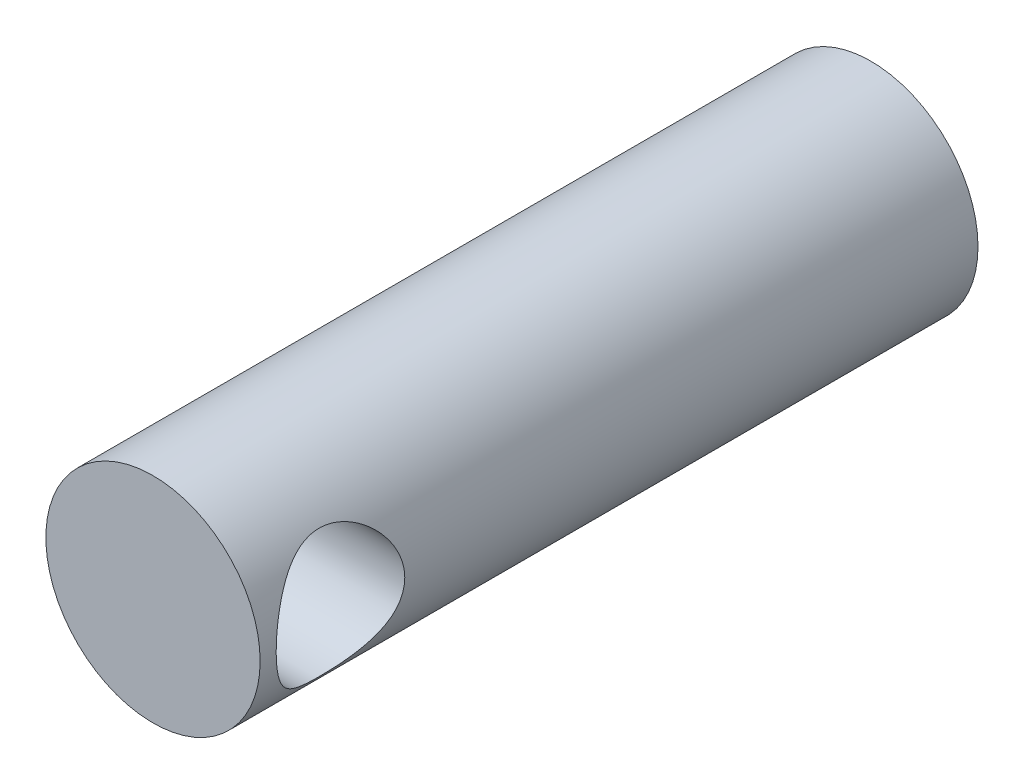
ISO-10303-21;
HEADER;
FILE_DESCRIPTION(('STEP AP214'),'2;1');
FILE_NAME('part.step','',(''),(''),'','','');
FILE_SCHEMA(('AUTOMOTIVE_DESIGN { 1 0 10303 214 1 1 1 1 }'));
ENDSEC;
DATA;
#1=APPLICATION_CONTEXT('core data for automotive mechanical design processes');
#2=APPLICATION_PROTOCOL_DEFINITION('international standard','automotive_design',2000,#1);
#3=PRODUCT_CONTEXT('',#1,'mechanical');
#4=PRODUCT('Part','Part','',(#3));
#5=PRODUCT_RELATED_PRODUCT_CATEGORY('part','',(#4));
#6=PRODUCT_DEFINITION_FORMATION('','',#4);
#7=PRODUCT_DEFINITION_CONTEXT('part definition',#1,'design');
#8=PRODUCT_DEFINITION('design','',#6,#7);
#9=PRODUCT_DEFINITION_SHAPE('','',#8);
#10=(LENGTH_UNIT() NAMED_UNIT(*) SI_UNIT(.MILLI.,.METRE.));
#11=(NAMED_UNIT(*) PLANE_ANGLE_UNIT() SI_UNIT($,.RADIAN.));
#12=(NAMED_UNIT(*) SI_UNIT($,.STERADIAN.) SOLID_ANGLE_UNIT());
#13=UNCERTAINTY_MEASURE_WITH_UNIT(LENGTH_MEASURE(1.E-05),#10,'distance_accuracy_value','');
#14=(GEOMETRIC_REPRESENTATION_CONTEXT(3) GLOBAL_UNCERTAINTY_ASSIGNED_CONTEXT((#13)) GLOBAL_UNIT_ASSIGNED_CONTEXT((#10,
#11,#12)) REPRESENTATION_CONTEXT('',''));
#15=CARTESIAN_POINT('',(0.,0.,0.));
#16=DIRECTION('',(0.,0.,1.));
#17=DIRECTION('',(1.,0.,0.));
#18=AXIS2_PLACEMENT_3D('',#15,#16,#17);
#19=CARTESIAN_POINT('',(0.,0.,67.));
#20=DIRECTION('',(0.,0.,-1.));
#21=DIRECTION('',(-1.,0.,0.));
#22=AXIS2_PLACEMENT_3D('',#19,#20,#21);
#23=CYLINDRICAL_SURFACE('',#22,10.);
#24=CARTESIAN_POINT('',(-10.,0.,53.5));
#25=CARTESIAN_POINT('',(-9.99999883168644,0.153537444551437,53.5000012548086));
#26=CARTESIAN_POINT('',(-9.99645496091162,0.307113729394928,53.5059026426005));
#27=CARTESIAN_POINT('',(-9.98236364463673,0.613107521326879,53.5294330131588));
#28=CARTESIAN_POINT('',(-9.97181210130936,0.765524297600021,53.5470688578121));
#29=CARTESIAN_POINT('',(-9.94394249918953,1.06824745150987,53.5938721043492));
#30=CARTESIAN_POINT('',(-9.92661163049899,1.21854927251923,53.6230613382259));
#31=CARTESIAN_POINT('',(-9.8856010527718,1.51572002727398,53.6925999382584));
#32=CARTESIAN_POINT('',(-9.86191863289495,1.66258746605991,53.7329540698223));
#33=CARTESIAN_POINT('',(-9.80890481966906,1.95109561530948,53.824087600897));
#34=CARTESIAN_POINT('',(-9.77960483164847,2.0927603969022,53.87480914043));
#35=CARTESIAN_POINT('',(-9.7159192851634,2.37093083799643,53.9862743691114));
#36=CARTESIAN_POINT('',(-9.68153176235135,2.50743447905546,54.0470219304578));
#37=CARTESIAN_POINT('',(-9.57184162303337,2.90796291658618,54.2433840785194));
#38=CARTESIAN_POINT('',(-9.48994167822569,3.16336977600851,54.3932348593339));
#39=CARTESIAN_POINT('',(-9.30821070093224,3.66523770071096,54.7391081430813));
#40=CARTESIAN_POINT('',(-9.20748739861886,3.90952112480154,54.9377851324869));
#41=CARTESIAN_POINT('',(-9.00120183744764,4.36354579042123,55.369898502178));
#42=CARTESIAN_POINT('',(-8.8956334984452,4.5732420237422,55.6033794326266));
#43=CARTESIAN_POINT('',(-8.73441166956492,4.87082578782843,55.9919989978208));
#44=CARTESIAN_POINT('',(-8.67715724472594,4.97182330842636,56.1366326182451));
#45=CARTESIAN_POINT('',(-8.5658531778253,5.1612212273106,56.4351943573764));
#46=CARTESIAN_POINT('',(-8.51180406592499,5.24961954505303,56.5891240052026));
#47=CARTESIAN_POINT('',(-8.4089084373516,5.41290775237597,56.9053776824133));
#48=CARTESIAN_POINT('',(-8.36005516160797,5.4878152818546,57.0676903876683));
#49=CARTESIAN_POINT('',(-8.26947589323733,5.62338163354012,57.4000581708195));
#50=CARTESIAN_POINT('',(-8.2277472424206,5.68404577312336,57.5701103310086));
#51=CARTESIAN_POINT('',(-8.16237611554733,5.77737221892759,57.874920079138));
#52=CARTESIAN_POINT('',(-8.13679954295731,5.8132588951073,58.0082833488659));
#53=CARTESIAN_POINT('',(-8.09168021123357,5.87590039350671,58.2781295178189));
#54=CARTESIAN_POINT('',(-8.0721361154497,5.90265723881366,58.414611718756));
#55=CARTESIAN_POINT('',(-8.03976789878061,5.94666970539669,58.6897482859787));
#56=CARTESIAN_POINT('',(-8.02693687297641,5.96393509031571,58.8284002686418));
#57=CARTESIAN_POINT('',(-8.00843825390026,5.98875266380351,59.107055015301));
#58=CARTESIAN_POINT('',(-8.00277078393386,5.99630468517718,59.2470578025065));
#59=CARTESIAN_POINT('',(-7.99881555301095,6.00157990771219,59.527630485736));
#60=CARTESIAN_POINT('',(-8.00054234240932,5.99928372966397,59.6682009556071));
#61=CARTESIAN_POINT('',(-8.01134007353733,5.98485668610317,59.948547368446));
#62=CARTESIAN_POINT('',(-8.02041105095058,5.97272577280601,60.08832330755));
#63=CARTESIAN_POINT('',(-8.04555965197211,5.93880584038254,60.3661231944088));
#64=CARTESIAN_POINT('',(-8.06164043478003,5.91701246647433,60.5041463233038));
#65=CARTESIAN_POINT('',(-8.10022471868288,5.86407894147697,60.777494591076));
#66=CARTESIAN_POINT('',(-8.12273084444056,5.83293497053064,60.9128186031844));
#67=CARTESIAN_POINT('',(-8.19812127089691,5.7269806380151,61.3099607815556));
#68=CARTESIAN_POINT('',(-8.25926888138427,5.63915194131273,61.5668706370872));
#69=CARTESIAN_POINT('',(-8.39708163578851,5.43180047493028,62.0628175566807));
#70=CARTESIAN_POINT('',(-8.47375246584325,5.31226608650176,62.3018480274799));
#71=CARTESIAN_POINT('',(-8.65022234735539,5.02070076963739,62.7999480266043));
#72=CARTESIAN_POINT('',(-8.75172142070218,4.84314550121071,63.0552148804664));
#73=CARTESIAN_POINT('',(-8.90582410728345,4.54957124280611,63.4147691760174));
#74=CARTESIAN_POINT('',(-8.95754136048026,4.4470831857426,63.5308102231317));
#75=CARTESIAN_POINT('',(-9.06053415675083,4.23329437801548,63.7547824138109));
#76=CARTESIAN_POINT('',(-9.11180961955593,4.12199206183186,63.8627121100362));
#77=CARTESIAN_POINT('',(-9.21989326570382,3.87481857478411,64.0844378033889));
#78=CARTESIAN_POINT('',(-9.27647282365172,3.73768795265439,64.1969446098408));
#79=CARTESIAN_POINT('',(-9.38610941141659,3.45314122942451,64.4099266645909));
#80=CARTESIAN_POINT('',(-9.43916780480959,3.30572915572594,64.5104065825761));
#81=CARTESIAN_POINT('',(-9.54033102133581,3.00130059968159,64.6984805100332));
#82=CARTESIAN_POINT('',(-9.58843643110623,2.84428525827773,64.7860760460744));
#83=CARTESIAN_POINT('',(-9.67831544597727,2.52155783578281,64.947410241838));
#84=CARTESIAN_POINT('',(-9.72008983683586,2.35584683737314,65.0211506214301));
#85=CARTESIAN_POINT('',(-9.79364255267099,2.02757278212964,65.149604220474));
#86=CARTESIAN_POINT('',(-9.82588466787389,1.86546851518058,65.205223147606));
#87=CARTESIAN_POINT('',(-9.88276955471718,1.53584722067876,65.3026459542524));
#88=CARTESIAN_POINT('',(-9.90741254446339,1.36833034862803,65.3444502302696));
#89=CARTESIAN_POINT('',(-9.94832818480364,1.02949369065074,65.4135444927888));
#90=CARTESIAN_POINT('',(-9.96460917751309,0.858177873374292,65.4408489455661));
#91=CARTESIAN_POINT('',(-9.9883166876579,0.513226306032277,65.4805289353702));
#92=CARTESIAN_POINT('',(-9.99574445045558,0.33959088573523,65.4929065721187));
#93=CARTESIAN_POINT('',(-10.0011181661532,0.0154285942464081,65.5018638200681));
#94=CARTESIAN_POINT('',(-10.0002160020556,-0.135030316693097,65.5003625940574));
#95=CARTESIAN_POINT('',(-9.99165275901541,-0.435218261170662,65.4860804379589));
#96=CARTESIAN_POINT('',(-9.98399190272153,-0.584947318588593,65.4732998794413));
#97=CARTESIAN_POINT('',(-9.96209775285792,-0.88253605659131,65.4366326369676));
#98=CARTESIAN_POINT('',(-9.94786490811761,-1.03039586412687,65.4127467114441));
#99=CARTESIAN_POINT('',(-9.91316547299699,-1.32321247217727,65.3541784518886));
#100=CARTESIAN_POINT('',(-9.89269872783916,-1.46816920051816,65.3194958497924));
#101=CARTESIAN_POINT('',(-9.84657104453397,-1.75071908629024,65.240727839033));
#102=CARTESIAN_POINT('',(-9.82105034214295,-1.88840566825773,65.1968948586283));
#103=CARTESIAN_POINT('',(-9.76505054291717,-2.15939029274508,65.0998014670251));
#104=CARTESIAN_POINT('',(-9.73456984870001,-2.29268690477591,65.0465380182235));
#105=CARTESIAN_POINT('',(-9.63657710202719,-2.68492536011212,64.8733367560109));
#106=CARTESIAN_POINT('',(-9.56247925125988,-2.9364228638402,64.7399295203489));
#107=CARTESIAN_POINT('',(-9.39381699318939,-3.44006129431899,64.4257648803306));
#108=CARTESIAN_POINT('',(-9.29792673244943,-3.68956141515481,64.2415307371737));
#109=CARTESIAN_POINT('',(-9.0989559830121,-4.15611932969621,63.8384083420505));
#110=CARTESIAN_POINT('',(-8.99586720626163,-4.37313879233221,63.6194797638093));
#111=CARTESIAN_POINT('',(-8.83567180051123,-4.68476192706763,63.25276518009));
#112=CARTESIAN_POINT('',(-8.77804452474303,-4.79158950335553,63.1153895839449));
#113=CARTESIAN_POINT('',(-8.66487441639236,-4.99332637800024,62.8312226254713));
#114=CARTESIAN_POINT('',(-8.60933212529389,-5.08823259511329,62.6844288436304));
#115=CARTESIAN_POINT('',(-8.50216742436206,-5.26534568264164,62.3821531306063));
#116=CARTESIAN_POINT('',(-8.45054240595251,-5.34756104251849,62.2266771029892));
#117=CARTESIAN_POINT('',(-8.35308038859147,-5.49855628026276,61.9076913158731));
#118=CARTESIAN_POINT('',(-8.30723930239863,-5.56734566466806,61.7441873441473));
#119=CARTESIAN_POINT('',(-8.23231224945507,-5.67736385859908,61.4460369976618));
#120=CARTESIAN_POINT('',(-8.20174483337218,-5.72133709184489,61.3127706139868));
#121=CARTESIAN_POINT('',(-8.14626667510692,-5.80005690886225,61.0424462632691));
#122=CARTESIAN_POINT('',(-8.12135296146617,-5.83480834103846,60.9053903306203));
#123=CARTESIAN_POINT('',(-8.07801879862435,-5.89465688853871,60.6283115957084));
#124=CARTESIAN_POINT('',(-8.05959195410913,-5.91976351478429,60.4882918606535));
#125=CARTESIAN_POINT('',(-8.02987210085861,-5.96001537328251,60.2060674786415));
#126=CARTESIAN_POINT('',(-8.01857913377508,-5.97516054737435,60.0638628189324));
#127=CARTESIAN_POINT('',(-8.00354222283989,-5.99528753337018,59.7777861758266));
#128=CARTESIAN_POINT('',(-7.99982722750099,-6.00023037231477,59.6339099024415));
#129=CARTESIAN_POINT('',(-8.00018515536028,-5.99975311757476,59.3461842597292));
#130=CARTESIAN_POINT('',(-8.00425809224594,-5.99433300567702,59.2023348904498));
#131=CARTESIAN_POINT('',(-8.02002886262283,-5.97321593242882,58.9157510433412));
#132=CARTESIAN_POINT('',(-8.03173032236348,-5.9575140835971,58.773017128419));
#133=CARTESIAN_POINT('',(-8.0622995620907,-5.916078552316,58.4898018457589));
#134=CARTESIAN_POINT('',(-8.08116737166848,-5.89034482844308,58.3493204873248));
#135=CARTESIAN_POINT('',(-8.12430163249587,-5.83069515235668,58.0782741425903));
#136=CARTESIAN_POINT('',(-8.14826151524264,-5.79723709119028,57.9475588407941));
#137=CARTESIAN_POINT('',(-8.20131354814819,-5.72193802024644,57.689614258587));
#138=CARTESIAN_POINT('',(-8.23040742870393,-5.68009418342386,57.5623861702864));
#139=CARTESIAN_POINT('',(-8.32420030637916,-5.54256357829891,57.1867725384605));
#140=CARTESIAN_POINT('',(-8.39543383966225,-5.4348469259726,56.9443200465293));
#141=CARTESIAN_POINT('',(-8.5605234540185,-5.1715656897821,56.4426872635962));
#142=CARTESIAN_POINT('',(-8.6561736985039,-5.01119401055786,56.1866538743708));
#143=CARTESIAN_POINT('',(-8.85281489413666,-4.65500060946758,55.7024614046252));
#144=CARTESIAN_POINT('',(-8.95381019436586,-4.45914969547373,55.4743255389019));
#145=CARTESIAN_POINT('',(-9.11118672816113,-4.12370341470836,55.13816339612));
#146=CARTESIAN_POINT('',(-9.16858001952611,-3.9947869496437,55.0197749573298));
#147=CARTESIAN_POINT('',(-9.28086988407214,-3.72646931290711,54.7942465024977));
#148=CARTESIAN_POINT('',(-9.3357672170491,-3.58707136666572,54.6871030501927));
#149=CARTESIAN_POINT('',(-9.44166188164684,-3.29828675494299,54.4847819954334));
#150=CARTESIAN_POINT('',(-9.49265642349904,-3.1488930847401,54.3896129217052));
#151=CARTESIAN_POINT('',(-9.58931425936428,-2.84096458145435,54.2122331487959));
#152=CARTESIAN_POINT('',(-9.63497822073852,-2.68243089637473,54.1300208270442));
#153=CARTESIAN_POINT('',(-9.71838319081371,-2.36211349400594,53.9817928441745));
#154=CARTESIAN_POINT('',(-9.75632252421502,-2.20057425723905,53.9153615047739));
#155=CARTESIAN_POINT('',(-9.82486154361094,-1.87094026552717,53.796469046806));
#156=CARTESIAN_POINT('',(-9.85546263753238,-1.70284677529885,53.7440052481898));
#157=CARTESIAN_POINT('',(-9.90830915235696,-1.36200638705993,53.6539830566488));
#158=CARTESIAN_POINT('',(-9.93058053649488,-1.18927577776317,53.6163783277853));
#159=CARTESIAN_POINT('',(-9.96616672075864,-0.840366716144965,53.5565108073647));
#160=CARTESIAN_POINT('',(-9.97948898025471,-0.664191261592127,53.5342352381028));
#161=CARTESIAN_POINT('',(-9.99207457493582,-0.406248020354699,53.513216627627));
#162=CARTESIAN_POINT('',(-9.99504405536016,-0.32511286923235,53.5082630243228));
#163=CARTESIAN_POINT('',(-9.99900711160739,-0.16265544935752,53.5016543209453));
#164=CARTESIAN_POINT('',(-10.0000006188891,-0.0813331742121648,53.499999335292));
#165=CARTESIAN_POINT('',(-10.,0.,53.5));
#166=B_SPLINE_CURVE_WITH_KNOTS('',3,(#24,#25,#26,#27,#28,#29,#30,#31,#32,#33,#34,#35,#36,#37,
#38,#39,#40,#41,#42,#43,#44,#45,#46,#47,#48,#49,#50,#51,#52,#53,#54,#55,#56,#57,#58,#59,#60,#61,
#62,#63,#64,#65,#66,#67,#68,#69,#70,#71,#72,#73,#74,#75,#76,#77,#78,#79,#80,#81,#82,#83,#84,#85,
#86,#87,#88,#89,#90,#91,#92,#93,#94,#95,#96,#97,#98,#99,#100,#101,#102,#103,#104,#105,#106,#107,
#108,#109,#110,#111,#112,#113,#114,#115,#116,#117,#118,#119,#120,#121,#122,#123,#124,#125,#126,
#127,#128,#129,#130,#131,#132,#133,#134,#135,#136,#137,#138,#139,#140,#141,#142,#143,#144,#145,
#146,#147,#148,#149,#150,#151,#152,#153,#154,#155,#156,#157,#158,#159,#160,#161,#162,#163,#164,
#165),.UNSPECIFIED.,.T.,.F.,(4,2,2,2,2,2,2,2,2,2,2,2,2,2,2,2,2,2,2,2,2,2,2,2,2,2,2,2,2,2,2,2,2,
2,2,2,2,2,2,2,2,2,2,2,2,2,2,2,2,2,2,2,2,2,2,2,2,2,2,2,2,2,2,2,2,2,2,2,2,2,4),(0.,
0.460526601189237,0.9213227386668,1.38299381403058,1.84486224490669,2.30422013956031,
2.76375586197537,3.68167311554442,4.66978395284545,5.65917064091953,6.21499415637785,
6.77090935054837,7.32609229452151,7.88106764554411,8.30201487574486,8.72286876721019,
9.14328892216061,9.56371631366182,9.98497139806241,10.4062285292501,10.8276757104407,
11.2492952938387,12.0807558666506,12.9125215553463,13.8897049719635,14.3790534646455,
14.8684890673691,15.4263461011955,15.983985828052,16.5415594312421,17.0990637758595,
17.6214641151699,18.1438494594443,18.6657126431692,19.1875024090024,19.638346895262,
20.0891765301004,20.5399753803935,20.9907854241961,21.4305002375879,21.8703569439357,
22.7494233427058,23.7197001490793,24.6911131196183,25.2405264723239,25.7900815377538,
26.3392673739261,26.8880629256888,27.3185187217207,27.7487477532129,28.1785514321198,
28.6083576204496,29.0398026540948,29.4712484460159,29.9028994771413,30.3345522906549,
30.7452488920627,31.156084182716,31.9773303104338,32.9246646516038,33.8727820243207,
34.4248169890477,34.9766827677429,35.5289394130232,36.0811268442984,36.6165634055117,
37.1518971546364,37.6855481107011,38.2187536985203,38.4626993445495,38.706653452248),.UNSPECIFIED.);
#167=CARTESIAN_POINT('',(-10.,0.,53.5));
#168=VERTEX_POINT('',#167);
#169=EDGE_CURVE('E10',#168,#168,#166,.T.);
#170=ORIENTED_EDGE('',*,*,#169,.T.);
#171=EDGE_LOOP('',(#170));
#172=FACE_BOUND('',#171,.T.);
#173=CARTESIAN_POINT('',(10.,0.,53.5));
#174=CARTESIAN_POINT('',(9.99999883168644,-0.153537444551437,53.5000012548086));
#175=CARTESIAN_POINT('',(9.99645496091162,-0.307113729394928,53.5059026426005));
#176=CARTESIAN_POINT('',(9.98236364463673,-0.613107521326879,53.5294330131588));
#177=CARTESIAN_POINT('',(9.97181210130936,-0.765524297600021,53.5470688578121));
#178=CARTESIAN_POINT('',(9.94394249918953,-1.06824745150987,53.5938721043492));
#179=CARTESIAN_POINT('',(9.92661163049899,-1.21854927251923,53.6230613382259));
#180=CARTESIAN_POINT('',(9.8856010527718,-1.51572002727398,53.6925999382584));
#181=CARTESIAN_POINT('',(9.86191863289495,-1.66258746605991,53.7329540698223));
#182=CARTESIAN_POINT('',(9.80890481966906,-1.95109561530948,53.824087600897));
#183=CARTESIAN_POINT('',(9.77960483164847,-2.09276039690219,53.87480914043));
#184=CARTESIAN_POINT('',(9.7159192851634,-2.37093083799643,53.9862743691114));
#185=CARTESIAN_POINT('',(9.68153176235135,-2.50743447905546,54.0470219304578));
#186=CARTESIAN_POINT('',(9.57184162303337,-2.90796291658618,54.2433840785194));
#187=CARTESIAN_POINT('',(9.48994167822569,-3.16336977600851,54.3932348593339));
#188=CARTESIAN_POINT('',(9.30821070093224,-3.66523770071096,54.7391081430813));
#189=CARTESIAN_POINT('',(9.20748739861886,-3.90952112480154,54.9377851324869));
#190=CARTESIAN_POINT('',(9.00120183744764,-4.36354579042123,55.369898502178));
#191=CARTESIAN_POINT('',(8.8956334984452,-4.5732420237422,55.6033794326266));
#192=CARTESIAN_POINT('',(8.73441166956492,-4.87082578782843,55.9919989978208));
#193=CARTESIAN_POINT('',(8.67715724472594,-4.97182330842636,56.1366326182451));
#194=CARTESIAN_POINT('',(8.5658531778253,-5.1612212273106,56.4351943573764));
#195=CARTESIAN_POINT('',(8.51180406592499,-5.24961954505303,56.5891240052026));
#196=CARTESIAN_POINT('',(8.4089084373516,-5.41290775237597,56.9053776824133));
#197=CARTESIAN_POINT('',(8.36005516160797,-5.4878152818546,57.0676903876683));
#198=CARTESIAN_POINT('',(8.26947589323733,-5.62338163354012,57.4000581708195));
#199=CARTESIAN_POINT('',(8.2277472424206,-5.68404577312336,57.5701103310086));
#200=CARTESIAN_POINT('',(8.16237611554733,-5.77737221892759,57.874920079138));
#201=CARTESIAN_POINT('',(8.13679954295731,-5.8132588951073,58.0082833488659));
#202=CARTESIAN_POINT('',(8.09168021123357,-5.87590039350671,58.2781295178189));
#203=CARTESIAN_POINT('',(8.0721361154497,-5.90265723881366,58.414611718756));
#204=CARTESIAN_POINT('',(8.03976789878061,-5.94666970539669,58.6897482859787));
#205=CARTESIAN_POINT('',(8.02693687297641,-5.96393509031571,58.8284002686418));
#206=CARTESIAN_POINT('',(8.00843825390026,-5.98875266380351,59.107055015301));
#207=CARTESIAN_POINT('',(8.00277078393386,-5.99630468517718,59.2470578025065));
#208=CARTESIAN_POINT('',(7.99881555301095,-6.00157990771219,59.527630485736));
#209=CARTESIAN_POINT('',(8.00054234240932,-5.99928372966397,59.6682009556071));
#210=CARTESIAN_POINT('',(8.01134007353733,-5.98485668610317,59.948547368446));
#211=CARTESIAN_POINT('',(8.02041105095058,-5.97272577280601,60.08832330755));
#212=CARTESIAN_POINT('',(8.04555965197211,-5.93880584038254,60.3661231944088));
#213=CARTESIAN_POINT('',(8.06164043478003,-5.91701246647433,60.5041463233038));
#214=CARTESIAN_POINT('',(8.10022471868288,-5.86407894147697,60.777494591076));
#215=CARTESIAN_POINT('',(8.12273084444056,-5.83293497053064,60.9128186031844));
#216=CARTESIAN_POINT('',(8.19812127089691,-5.7269806380151,61.3099607815556));
#217=CARTESIAN_POINT('',(8.25926888138427,-5.63915194131273,61.5668706370872));
#218=CARTESIAN_POINT('',(8.39708163578851,-5.43180047493028,62.0628175566807));
#219=CARTESIAN_POINT('',(8.47375246584325,-5.31226608650176,62.3018480274799));
#220=CARTESIAN_POINT('',(8.65022234735539,-5.02070076963739,62.7999480266043));
#221=CARTESIAN_POINT('',(8.75172142070218,-4.84314550121071,63.0552148804664));
#222=CARTESIAN_POINT('',(8.90582410728345,-4.54957124280611,63.4147691760174));
#223=CARTESIAN_POINT('',(8.95754136048026,-4.4470831857426,63.5308102231317));
#224=CARTESIAN_POINT('',(9.06053415675083,-4.23329437801548,63.7547824138109));
#225=CARTESIAN_POINT('',(9.11180961955593,-4.12199206183186,63.8627121100362));
#226=CARTESIAN_POINT('',(9.21989326570382,-3.87481857478411,64.0844378033889));
#227=CARTESIAN_POINT('',(9.27647282365172,-3.73768795265439,64.1969446098408));
#228=CARTESIAN_POINT('',(9.38610941141659,-3.45314122942451,64.4099266645909));
#229=CARTESIAN_POINT('',(9.43916780480959,-3.30572915572594,64.5104065825761));
#230=CARTESIAN_POINT('',(9.54033102133581,-3.00130059968159,64.6984805100332));
#231=CARTESIAN_POINT('',(9.58843643110623,-2.84428525827773,64.7860760460744));
#232=CARTESIAN_POINT('',(9.67831544597727,-2.52155783578281,64.947410241838));
#233=CARTESIAN_POINT('',(9.72008983683586,-2.35584683737314,65.0211506214301));
#234=CARTESIAN_POINT('',(9.79364255267099,-2.02757278212964,65.149604220474));
#235=CARTESIAN_POINT('',(9.82588466787389,-1.86546851518058,65.205223147606));
#236=CARTESIAN_POINT('',(9.88276955471718,-1.53584722067876,65.3026459542524));
#237=CARTESIAN_POINT('',(9.90741254446339,-1.36833034862803,65.3444502302696));
#238=CARTESIAN_POINT('',(9.94832818480364,-1.02949369065074,65.4135444927888));
#239=CARTESIAN_POINT('',(9.96460917751309,-0.858177873374292,65.4408489455661));
#240=CARTESIAN_POINT('',(9.9883166876579,-0.513226306032277,65.4805289353702));
#241=CARTESIAN_POINT('',(9.99574445045558,-0.33959088573523,65.4929065721187));
#242=CARTESIAN_POINT('',(10.0011181661532,-0.0154285942464081,65.5018638200681));
#243=CARTESIAN_POINT('',(10.0002160020556,0.135030316693097,65.5003625940574));
#244=CARTESIAN_POINT('',(9.99165275901541,0.435218261170662,65.4860804379589));
#245=CARTESIAN_POINT('',(9.98399190272153,0.584947318588593,65.4732998794413));
#246=CARTESIAN_POINT('',(9.96209775285792,0.88253605659131,65.4366326369676));
#247=CARTESIAN_POINT('',(9.94786490811761,1.03039586412687,65.4127467114441));
#248=CARTESIAN_POINT('',(9.91316547299699,1.32321247217727,65.3541784518886));
#249=CARTESIAN_POINT('',(9.89269872783916,1.46816920051816,65.3194958497924));
#250=CARTESIAN_POINT('',(9.84657104453397,1.75071908629024,65.240727839033));
#251=CARTESIAN_POINT('',(9.82105034214295,1.88840566825773,65.1968948586283));
#252=CARTESIAN_POINT('',(9.76505054291717,2.15939029274508,65.0998014670251));
#253=CARTESIAN_POINT('',(9.73456984870001,2.29268690477591,65.0465380182235));
#254=CARTESIAN_POINT('',(9.63657710202719,2.68492536011212,64.8733367560109));
#255=CARTESIAN_POINT('',(9.56247925125988,2.9364228638402,64.7399295203489));
#256=CARTESIAN_POINT('',(9.39381699318939,3.44006129431899,64.4257648803306));
#257=CARTESIAN_POINT('',(9.29792673244943,3.68956141515481,64.2415307371737));
#258=CARTESIAN_POINT('',(9.0989559830121,4.15611932969621,63.8384083420505));
#259=CARTESIAN_POINT('',(8.99586720626163,4.37313879233221,63.6194797638093));
#260=CARTESIAN_POINT('',(8.83567180051123,4.68476192706763,63.25276518009));
#261=CARTESIAN_POINT('',(8.77804452474303,4.79158950335553,63.1153895839449));
#262=CARTESIAN_POINT('',(8.66487441639236,4.99332637800024,62.8312226254713));
#263=CARTESIAN_POINT('',(8.60933212529389,5.08823259511329,62.6844288436304));
#264=CARTESIAN_POINT('',(8.50216742436206,5.26534568264164,62.3821531306063));
#265=CARTESIAN_POINT('',(8.45054240595251,5.34756104251849,62.2266771029892));
#266=CARTESIAN_POINT('',(8.35308038859147,5.49855628026276,61.9076913158731));
#267=CARTESIAN_POINT('',(8.30723930239863,5.56734566466806,61.7441873441473));
#268=CARTESIAN_POINT('',(8.23231224945507,5.67736385859908,61.4460369976618));
#269=CARTESIAN_POINT('',(8.20174483337218,5.72133709184489,61.3127706139868));
#270=CARTESIAN_POINT('',(8.14626667510692,5.80005690886225,61.0424462632691));
#271=CARTESIAN_POINT('',(8.12135296146617,5.83480834103846,60.9053903306203));
#272=CARTESIAN_POINT('',(8.07801879862435,5.89465688853871,60.6283115957084));
#273=CARTESIAN_POINT('',(8.05959195410913,5.91976351478429,60.4882918606535));
#274=CARTESIAN_POINT('',(8.02987210085861,5.96001537328251,60.2060674786415));
#275=CARTESIAN_POINT('',(8.01857913377508,5.97516054737435,60.0638628189324));
#276=CARTESIAN_POINT('',(8.00354222283989,5.99528753337018,59.7777861758266));
#277=CARTESIAN_POINT('',(7.99982722750099,6.00023037231477,59.6339099024415));
#278=CARTESIAN_POINT('',(8.00018515536028,5.99975311757476,59.3461842597292));
#279=CARTESIAN_POINT('',(8.00425809224594,5.99433300567702,59.2023348904498));
#280=CARTESIAN_POINT('',(8.02002886262283,5.97321593242882,58.9157510433412));
#281=CARTESIAN_POINT('',(8.03173032236348,5.9575140835971,58.773017128419));
#282=CARTESIAN_POINT('',(8.0622995620907,5.916078552316,58.4898018457589));
#283=CARTESIAN_POINT('',(8.08116737166848,5.89034482844308,58.3493204873248));
#284=CARTESIAN_POINT('',(8.12430163249587,5.83069515235668,58.0782741425903));
#285=CARTESIAN_POINT('',(8.14826151524264,5.79723709119028,57.9475588407941));
#286=CARTESIAN_POINT('',(8.20131354814819,5.72193802024644,57.689614258587));
#287=CARTESIAN_POINT('',(8.23040742870393,5.68009418342386,57.5623861702864));
#288=CARTESIAN_POINT('',(8.32420030637916,5.54256357829891,57.1867725384605));
#289=CARTESIAN_POINT('',(8.39543383966225,5.4348469259726,56.9443200465293));
#290=CARTESIAN_POINT('',(8.5605234540185,5.1715656897821,56.4426872635962));
#291=CARTESIAN_POINT('',(8.6561736985039,5.01119401055786,56.1866538743708));
#292=CARTESIAN_POINT('',(8.85281489413666,4.65500060946758,55.7024614046252));
#293=CARTESIAN_POINT('',(8.95381019436586,4.45914969547373,55.4743255389019));
#294=CARTESIAN_POINT('',(9.11118672816113,4.12370341470836,55.13816339612));
#295=CARTESIAN_POINT('',(9.16858001952611,3.9947869496437,55.0197749573298));
#296=CARTESIAN_POINT('',(9.28086988407214,3.72646931290711,54.7942465024977));
#297=CARTESIAN_POINT('',(9.3357672170491,3.58707136666572,54.6871030501927));
#298=CARTESIAN_POINT('',(9.44166188164684,3.29828675494299,54.4847819954334));
#299=CARTESIAN_POINT('',(9.49265642349904,3.1488930847401,54.3896129217052));
#300=CARTESIAN_POINT('',(9.58931425936428,2.84096458145435,54.2122331487959));
#301=CARTESIAN_POINT('',(9.63497822073852,2.68243089637473,54.1300208270442));
#302=CARTESIAN_POINT('',(9.71838319081371,2.36211349400594,53.9817928441745));
#303=CARTESIAN_POINT('',(9.75632252421502,2.20057425723905,53.9153615047739));
#304=CARTESIAN_POINT('',(9.82486154361094,1.87094026552717,53.796469046806));
#305=CARTESIAN_POINT('',(9.85546263753238,1.70284677529885,53.7440052481898));
#306=CARTESIAN_POINT('',(9.90830915235696,1.36200638705993,53.6539830566488));
#307=CARTESIAN_POINT('',(9.93058053649488,1.18927577776317,53.6163783277853));
#308=CARTESIAN_POINT('',(9.96616672075864,0.840366716144965,53.5565108073647));
#309=CARTESIAN_POINT('',(9.97948898025471,0.664191261592126,53.5342352381028));
#310=CARTESIAN_POINT('',(9.99207457493582,0.406248020354699,53.513216627627));
#311=CARTESIAN_POINT('',(9.99504405536016,0.32511286923235,53.5082630243228));
#312=CARTESIAN_POINT('',(9.99900711160739,0.16265544935752,53.5016543209453));
#313=CARTESIAN_POINT('',(10.0000006188891,0.0813331742121648,53.499999335292));
#314=CARTESIAN_POINT('',(10.,0.,53.5));
#315=B_SPLINE_CURVE_WITH_KNOTS('',3,(#173,#174,#175,#176,#177,#178,#179,#180,#181,#182,#183,
#184,#185,#186,#187,#188,#189,#190,#191,#192,#193,#194,#195,#196,#197,#198,#199,#200,#201,#202,
#203,#204,#205,#206,#207,#208,#209,#210,#211,#212,#213,#214,#215,#216,#217,#218,#219,#220,#221,
#222,#223,#224,#225,#226,#227,#228,#229,#230,#231,#232,#233,#234,#235,#236,#237,#238,#239,#240,
#241,#242,#243,#244,#245,#246,#247,#248,#249,#250,#251,#252,#253,#254,#255,#256,#257,#258,#259,
#260,#261,#262,#263,#264,#265,#266,#267,#268,#269,#270,#271,#272,#273,#274,#275,#276,#277,#278,
#279,#280,#281,#282,#283,#284,#285,#286,#287,#288,#289,#290,#291,#292,#293,#294,#295,#296,#297,
#298,#299,#300,#301,#302,#303,#304,#305,#306,#307,#308,#309,#310,#311,#312,#313,#314),
.UNSPECIFIED.,.T.,.F.,(4,2,2,2,2,2,2,2,2,2,2,2,2,2,2,2,2,2,2,2,2,2,2,2,2,2,2,2,2,2,2,2,2,2,2,2,
2,2,2,2,2,2,2,2,2,2,2,2,2,2,2,2,2,2,2,2,2,2,2,2,2,2,2,2,2,2,2,2,2,2,4),(0.,0.460526601189237,
0.9213227386668,1.38299381403058,1.84486224490669,2.30422013956031,2.76375586197538,
3.68167311554442,4.66978395284545,5.65917064091953,6.21499415637785,6.77090935054837,
7.32609229452151,7.88106764554411,8.30201487574486,8.72286876721019,9.14328892216061,
9.56371631366182,9.98497139806241,10.4062285292501,10.8276757104407,11.2492952938387,
12.0807558666506,12.9125215553463,13.8897049719635,14.3790534646455,14.8684890673691,
15.4263461011955,15.983985828052,16.5415594312421,17.0990637758595,17.6214641151699,
18.1438494594443,18.6657126431692,19.1875024090024,19.638346895262,20.0891765301004,
20.5399753803935,20.9907854241961,21.4305002375879,21.8703569439357,22.7494233427058,
23.7197001490793,24.6911131196183,25.2405264723239,25.7900815377538,26.3392673739261,
26.8880629256888,27.3185187217207,27.7487477532129,28.1785514321198,28.6083576204496,
29.0398026540948,29.4712484460159,29.9028994771413,30.3345522906549,30.7452488920627,
31.156084182716,31.9773303104338,32.9246646516038,33.8727820243207,34.4248169890477,
34.9766827677429,35.5289394130232,36.0811268442984,36.6165634055117,37.1518971546364,
37.6855481107011,38.2187536985203,38.4626993445495,38.706653452248),.UNSPECIFIED.);
#316=CARTESIAN_POINT('',(10.,0.,53.5));
#317=VERTEX_POINT('',#316);
#318=EDGE_CURVE('E56',#317,#317,#315,.T.);
#319=ORIENTED_EDGE('',*,*,#318,.T.);
#320=EDGE_LOOP('',(#319));
#321=FACE_BOUND('',#320,.T.);
#322=CARTESIAN_POINT('',(0.,0.,67.));
#323=DIRECTION('',(0.,0.,1.));
#324=DIRECTION('',(1.,0.,0.));
#325=AXIS2_PLACEMENT_3D('',#322,#323,#324);
#326=CIRCLE('',#325,10.);
#327=CARTESIAN_POINT('',(10.,0.,67.));
#328=VERTEX_POINT('',#327);
#329=EDGE_CURVE('E60',#328,#328,#326,.T.);
#330=ORIENTED_EDGE('',*,*,#329,.F.);
#331=EDGE_LOOP('',(#330));
#332=FACE_BOUND('',#331,.T.);
#333=CARTESIAN_POINT('',(0.,0.,0.));
#334=DIRECTION('',(0.,0.,1.));
#335=DIRECTION('',(1.,0.,0.));
#336=AXIS2_PLACEMENT_3D('',#333,#334,#335);
#337=CIRCLE('',#336,10.);
#338=CARTESIAN_POINT('',(10.,0.,0.));
#339=VERTEX_POINT('',#338);
#340=EDGE_CURVE('E64',#339,#339,#337,.T.);
#341=ORIENTED_EDGE('',*,*,#340,.T.);
#342=EDGE_LOOP('',(#341));
#343=FACE_BOUND('',#342,.T.);
#344=ADVANCED_FACE('F45',(#172,#321,#332,#343),#23,.T.);
#345=CARTESIAN_POINT('',(0.,0.,67.));
#346=DIRECTION('',(0.,0.,1.));
#347=DIRECTION('',(1.,0.,0.));
#348=AXIS2_PLACEMENT_3D('',#345,#346,#347);
#349=PLANE('',#348);
#350=ORIENTED_EDGE('',*,*,#329,.T.);
#351=EDGE_LOOP('',(#350));
#352=FACE_BOUND('',#351,.T.);
#353=ADVANCED_FACE('F76',(#352),#349,.T.);
#354=CARTESIAN_POINT('',(0.,0.,0.));
#355=DIRECTION('',(0.,0.,1.));
#356=DIRECTION('',(1.,0.,0.));
#357=AXIS2_PLACEMENT_3D('',#354,#355,#356);
#358=PLANE('',#357);
#359=ORIENTED_EDGE('',*,*,#340,.F.);
#360=EDGE_LOOP('',(#359));
#361=FACE_BOUND('',#360,.T.);
#362=ADVANCED_FACE('F74',(#361),#358,.F.);
#363=CARTESIAN_POINT('',(-10.,0.,59.5));
#364=DIRECTION('',(1.,0.,0.));
#365=DIRECTION('',(0.,0.,-1.));
#366=AXIS2_PLACEMENT_3D('',#363,#364,#365);
#367=CYLINDRICAL_SURFACE('',#366,6.00000000000001);
#368=ORIENTED_EDGE('',*,*,#318,.F.);
#369=EDGE_LOOP('',(#368));
#370=FACE_BOUND('',#369,.T.);
#371=ORIENTED_EDGE('',*,*,#169,.F.);
#372=EDGE_LOOP('',(#371));
#373=FACE_BOUND('',#372,.T.);
#374=ADVANCED_FACE('F70',(#370,#373),#367,.F.);
#375=CLOSED_SHELL('',(#344,#353,#362,#374));
#376=MANIFOLD_SOLID_BREP('B2',#375);
#377=ADVANCED_BREP_SHAPE_REPRESENTATION('',(#18,#376),#14);
#378=SHAPE_DEFINITION_REPRESENTATION(#9,#377);
ENDSEC;
END-ISO-10303-21;
